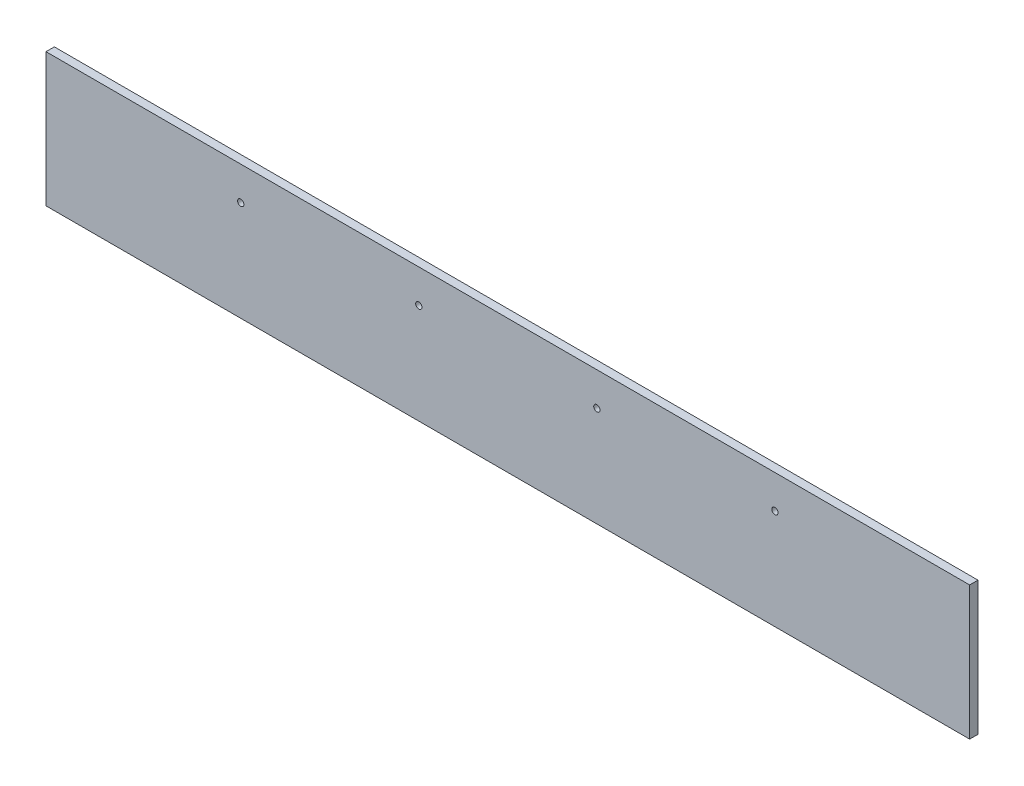
ISO-10303-21;
HEADER;
FILE_DESCRIPTION(('STEP AP214'),'2;1');
FILE_NAME('part.step','',(''),(''),'','','');
FILE_SCHEMA(('AUTOMOTIVE_DESIGN { 1 0 10303 214 1 1 1 1 }'));
ENDSEC;
DATA;
#1=APPLICATION_CONTEXT('core data for automotive mechanical design processes');
#2=APPLICATION_PROTOCOL_DEFINITION('international standard','automotive_design',2000,#1);
#3=PRODUCT_CONTEXT('',#1,'mechanical');
#4=PRODUCT('Part','Part','',(#3));
#5=PRODUCT_RELATED_PRODUCT_CATEGORY('part','',(#4));
#6=PRODUCT_DEFINITION_FORMATION('','',#4);
#7=PRODUCT_DEFINITION_CONTEXT('part definition',#1,'design');
#8=PRODUCT_DEFINITION('design','',#6,#7);
#9=PRODUCT_DEFINITION_SHAPE('','',#8);
#10=(LENGTH_UNIT() NAMED_UNIT(*) SI_UNIT(.MILLI.,.METRE.));
#11=(NAMED_UNIT(*) PLANE_ANGLE_UNIT() SI_UNIT($,.RADIAN.));
#12=(NAMED_UNIT(*) SI_UNIT($,.STERADIAN.) SOLID_ANGLE_UNIT());
#13=UNCERTAINTY_MEASURE_WITH_UNIT(LENGTH_MEASURE(1.E-05),#10,'distance_accuracy_value','');
#14=(GEOMETRIC_REPRESENTATION_CONTEXT(3) GLOBAL_UNCERTAINTY_ASSIGNED_CONTEXT((#13)) GLOBAL_UNIT_ASSIGNED_CONTEXT((#10,
#11,#12)) REPRESENTATION_CONTEXT('',''));
#15=CARTESIAN_POINT('',(0.,0.,0.));
#16=DIRECTION('',(0.,0.,1.));
#17=DIRECTION('',(1.,0.,0.));
#18=AXIS2_PLACEMENT_3D('',#15,#16,#17);
#19=CARTESIAN_POINT('',(0.,152.4,0.));
#20=DIRECTION('',(0.,1.,0.));
#21=DIRECTION('',(0.,0.,1.));
#22=AXIS2_PLACEMENT_3D('',#19,#20,#21);
#23=PLANE('',#22);
#24=DIRECTION('',(1.,0.,0.));
#25=VECTOR('',#24,1.);
#26=CARTESIAN_POINT('',(-558.014668370825,152.4,451.049254854641));
#27=LINE('',#26,#25);
#28=CARTESIAN_POINT('',(-558.014668370825,152.4,451.049254854641));
#29=VERTEX_POINT('',#28);
#30=CARTESIAN_POINT('',(496.085331629175,152.4,451.049254854641));
#31=VERTEX_POINT('',#30);
#32=EDGE_CURVE('E126',#29,#31,#27,.T.);
#33=ORIENTED_EDGE('',*,*,#32,.F.);
#34=DIRECTION('',(0.,0.,1.));
#35=VECTOR('',#34,1.);
#36=CARTESIAN_POINT('',(-558.014668370825,152.4,0.));
#37=LINE('',#36,#35);
#38=CARTESIAN_POINT('',(-558.014668370825,152.4,460.574254854641));
#39=VERTEX_POINT('',#38);
#40=EDGE_CURVE('E110',#29,#39,#37,.T.);
#41=ORIENTED_EDGE('',*,*,#40,.T.);
#42=DIRECTION('',(1.,0.,0.));
#43=VECTOR('',#42,1.);
#44=CARTESIAN_POINT('',(-567.539668370825,152.4,460.574254854641));
#45=LINE('',#44,#43);
#46=CARTESIAN_POINT('',(496.085331629175,152.4,460.574254854641));
#47=VERTEX_POINT('',#46);
#48=EDGE_CURVE('E124',#39,#47,#45,.T.);
#49=ORIENTED_EDGE('',*,*,#48,.T.);
#50=DIRECTION('',(0.,0.,-1.));
#51=VECTOR('',#50,1.);
#52=CARTESIAN_POINT('',(496.085331629173,152.4,-2.89115673151451E-12));
#53=LINE('',#52,#51);
#54=EDGE_CURVE('E151',#47,#31,#53,.T.);
#55=ORIENTED_EDGE('',*,*,#54,.T.);
#56=EDGE_LOOP('',(#33,#41,#49,#55));
#57=FACE_BOUND('',#56,.T.);
#58=ADVANCED_FACE('F47',(#57),#23,.T.);
#59=CARTESIAN_POINT('',(-567.539668370825,152.4,460.574254854641));
#60=DIRECTION('',(0.,0.,-1.));
#61=DIRECTION('',(-1.,0.,0.));
#62=AXIS2_PLACEMENT_3D('',#59,#60,#61);
#63=PLANE('',#62);
#64=CARTESIAN_POINT('',(273.835331629175,114.3,460.574254854641));
#65=DIRECTION('',(0.,0.,1.));
#66=DIRECTION('',(1.,0.,0.));
#67=AXIS2_PLACEMENT_3D('',#64,#65,#66);
#68=CIRCLE('',#67,3.56869999999998);
#69=CARTESIAN_POINT('',(277.404031629175,114.3,460.574254854641));
#70=VERTEX_POINT('',#69);
#71=EDGE_CURVE('E162',#70,#70,#68,.T.);
#72=ORIENTED_EDGE('',*,*,#71,.F.);
#73=EDGE_LOOP('',(#72));
#74=FACE_BOUND('',#73,.T.);
#75=CARTESIAN_POINT('',(70.6353316291751,114.3,460.574254854641));
#76=DIRECTION('',(0.,0.,1.));
#77=DIRECTION('',(1.,0.,0.));
#78=AXIS2_PLACEMENT_3D('',#75,#76,#77);
#79=CIRCLE('',#78,3.5687);
#80=CARTESIAN_POINT('',(74.2040316291751,114.3,460.574254854641));
#81=VERTEX_POINT('',#80);
#82=EDGE_CURVE('E166',#81,#81,#79,.T.);
#83=ORIENTED_EDGE('',*,*,#82,.F.);
#84=EDGE_LOOP('',(#83));
#85=FACE_BOUND('',#84,.T.);
#86=CARTESIAN_POINT('',(-132.564668370825,114.3,460.574254854641));
#87=DIRECTION('',(0.,0.,1.));
#88=DIRECTION('',(1.,0.,0.));
#89=AXIS2_PLACEMENT_3D('',#86,#87,#88);
#90=CIRCLE('',#89,3.56870000000001);
#91=CARTESIAN_POINT('',(-128.995968370825,114.3,460.574254854641));
#92=VERTEX_POINT('',#91);
#93=EDGE_CURVE('E169',#92,#92,#90,.T.);
#94=ORIENTED_EDGE('',*,*,#93,.F.);
#95=EDGE_LOOP('',(#94));
#96=FACE_BOUND('',#95,.T.);
#97=CARTESIAN_POINT('',(-335.764668370825,114.3,460.574254854641));
#98=DIRECTION('',(0.,0.,1.));
#99=DIRECTION('',(1.,0.,0.));
#100=AXIS2_PLACEMENT_3D('',#97,#98,#99);
#101=CIRCLE('',#100,3.56869999999998);
#102=CARTESIAN_POINT('',(-332.195968370825,114.3,460.574254854641));
#103=VERTEX_POINT('',#102);
#104=EDGE_CURVE('E161',#103,#103,#101,.T.);
#105=ORIENTED_EDGE('',*,*,#104,.F.);
#106=EDGE_LOOP('',(#105));
#107=FACE_BOUND('',#106,.T.);
#108=DIRECTION('',(0.,-1.,0.));
#109=VECTOR('',#108,1.);
#110=CARTESIAN_POINT('',(-558.014668370825,164.465,460.574254854641));
#111=LINE('',#110,#109);
#112=CARTESIAN_POINT('',(-558.014668370825,0.,460.574254854641));
#113=VERTEX_POINT('',#112);
#114=EDGE_CURVE('E107',#39,#113,#111,.T.);
#115=ORIENTED_EDGE('',*,*,#114,.T.);
#116=DIRECTION('',(1.,0.,0.));
#117=VECTOR('',#116,1.);
#118=CARTESIAN_POINT('',(-567.539668370825,0.,460.574254854641));
#119=LINE('',#118,#117);
#120=CARTESIAN_POINT('',(496.085331629175,0.,460.574254854641));
#121=VERTEX_POINT('',#120);
#122=EDGE_CURVE('E131',#113,#121,#119,.T.);
#123=ORIENTED_EDGE('',*,*,#122,.T.);
#124=DIRECTION('',(0.,-1.,0.));
#125=VECTOR('',#124,1.);
#126=CARTESIAN_POINT('',(496.085331629175,164.465,460.574254854641));
#127=LINE('',#126,#125);
#128=EDGE_CURVE('E118',#47,#121,#127,.T.);
#129=ORIENTED_EDGE('',*,*,#128,.F.);
#130=ORIENTED_EDGE('',*,*,#48,.F.);
#131=EDGE_LOOP('',(#115,#123,#129,#130));
#132=FACE_BOUND('',#131,.T.);
#133=ADVANCED_FACE('F49',(#74,#85,#96,#107,#132),#63,.F.);
#134=CARTESIAN_POINT('',(0.,0.,0.));
#135=DIRECTION('',(0.,1.,0.));
#136=DIRECTION('',(0.,0.,1.));
#137=AXIS2_PLACEMENT_3D('',#134,#135,#136);
#138=PLANE('',#137);
#139=DIRECTION('',(0.,0.,1.));
#140=VECTOR('',#139,1.);
#141=CARTESIAN_POINT('',(-558.014668370825,0.,0.));
#142=LINE('',#141,#140);
#143=CARTESIAN_POINT('',(-558.014668370825,0.,451.049254854641));
#144=VERTEX_POINT('',#143);
#145=EDGE_CURVE('E113',#144,#113,#142,.T.);
#146=ORIENTED_EDGE('',*,*,#145,.F.);
#147=DIRECTION('',(-0.707106781186547,0.,0.707106781186548));
#148=VECTOR('',#147,1.);
#149=CARTESIAN_POINT('',(-415.139668370826,0.,308.174254854641));
#150=LINE('',#149,#148);
#151=CARTESIAN_POINT('',(-415.139668370826,0.,308.174254854641));
#152=VERTEX_POINT('',#151);
#153=EDGE_CURVE('E145',#152,#144,#150,.T.);
#154=ORIENTED_EDGE('',*,*,#153,.F.);
#155=DIRECTION('',(1.,0.,0.));
#156=VECTOR('',#155,1.);
#157=CARTESIAN_POINT('',(0.,0.,308.174254854641));
#158=LINE('',#157,#156);
#159=CARTESIAN_POINT('',(353.210331629175,0.,308.174254854641));
#160=VERTEX_POINT('',#159);
#161=EDGE_CURVE('E130',#152,#160,#158,.T.);
#162=ORIENTED_EDGE('',*,*,#161,.T.);
#163=DIRECTION('',(-0.707106781186548,0.,-0.707106781186547));
#164=VECTOR('',#163,1.);
#165=CARTESIAN_POINT('',(505.610331629175,0.,460.574254854641));
#166=LINE('',#165,#164);
#167=CARTESIAN_POINT('',(496.085331629175,0.,451.049254854641));
#168=VERTEX_POINT('',#167);
#169=EDGE_CURVE('E63',#168,#160,#166,.T.);
#170=ORIENTED_EDGE('',*,*,#169,.F.);
#171=DIRECTION('',(0.,0.,-1.));
#172=VECTOR('',#171,1.);
#173=CARTESIAN_POINT('',(496.085331629173,0.,-2.89115673151451E-12));
#174=LINE('',#173,#172);
#175=EDGE_CURVE('E127',#121,#168,#174,.T.);
#176=ORIENTED_EDGE('',*,*,#175,.F.);
#177=ORIENTED_EDGE('',*,*,#122,.F.);
#178=EDGE_LOOP('',(#146,#154,#162,#170,#176,#177));
#179=FACE_BOUND('',#178,.T.);
#180=ADVANCED_FACE('F144',(#179),#138,.F.);
#181=CARTESIAN_POINT('',(505.610331629175,1016.,460.574254854641));
#182=DIRECTION('',(-0.707106781186547,0.,0.707106781186548));
#183=DIRECTION('',(0.707106781186548,0.,0.707106781186547));
#184=AXIS2_PLACEMENT_3D('',#181,#182,#183);
#185=PLANE('',#184);
#186=DIRECTION('',(0.,1.,0.));
#187=VECTOR('',#186,1.);
#188=CARTESIAN_POINT('',(496.085331629175,1016.,451.049254854641));
#189=LINE('',#188,#187);
#190=CARTESIAN_POINT('',(496.085331629175,9.52500000000001,451.049254854641));
#191=VERTEX_POINT('',#190);
#192=EDGE_CURVE('E11',#168,#191,#189,.T.);
#193=ORIENTED_EDGE('',*,*,#192,.F.);
#194=ORIENTED_EDGE('',*,*,#169,.T.);
#195=DIRECTION('',(0.,1.,0.));
#196=VECTOR('',#195,1.);
#197=CARTESIAN_POINT('',(353.210331629175,-133.35,308.174254854641));
#198=LINE('',#197,#196);
#199=CARTESIAN_POINT('',(353.210331629175,9.52500000000001,308.174254854641));
#200=VERTEX_POINT('',#199);
#201=EDGE_CURVE('E176',#160,#200,#198,.T.);
#202=ORIENTED_EDGE('',*,*,#201,.T.);
#203=DIRECTION('',(-0.707106781186548,0.,-0.707106781186547));
#204=VECTOR('',#203,1.);
#205=CARTESIAN_POINT('',(22.5180383872667,9.52500000000001,-22.5180383872667));
#206=LINE('',#205,#204);
#207=EDGE_CURVE('E153',#191,#200,#206,.T.);
#208=ORIENTED_EDGE('',*,*,#207,.F.);
#209=EDGE_LOOP('',(#193,#194,#202,#208));
#210=FACE_BOUND('',#209,.T.);
#211=ADVANCED_FACE('F214',(#210),#185,.F.);
#212=CARTESIAN_POINT('',(-415.139668370826,1016.,308.174254854641));
#213=DIRECTION('',(0.707106781186548,0.,0.707106781186547));
#214=DIRECTION('',(0.707106781186547,0.,-0.707106781186548));
#215=AXIS2_PLACEMENT_3D('',#212,#213,#214);
#216=PLANE('',#215);
#217=DIRECTION('',(0.,-1.,0.));
#218=VECTOR('',#217,1.);
#219=CARTESIAN_POINT('',(-558.014668370825,1016.,451.049254854641));
#220=LINE('',#219,#218);
#221=CARTESIAN_POINT('',(-558.014668370825,9.52500000000001,451.049254854641));
#222=VERTEX_POINT('',#221);
#223=EDGE_CURVE('E56',#222,#144,#220,.T.);
#224=ORIENTED_EDGE('',*,*,#223,.F.);
#225=DIRECTION('',(-0.707106781186547,0.,0.707106781186548));
#226=VECTOR('',#225,1.);
#227=CARTESIAN_POINT('',(-53.4827067580927,9.52500000000001,-53.4827067580926));
#228=LINE('',#227,#226);
#229=CARTESIAN_POINT('',(-415.139668370826,9.52500000000001,308.174254854641));
#230=VERTEX_POINT('',#229);
#231=EDGE_CURVE('E71',#230,#222,#228,.T.);
#232=ORIENTED_EDGE('',*,*,#231,.F.);
#233=DIRECTION('',(0.,1.,0.));
#234=VECTOR('',#233,1.);
#235=CARTESIAN_POINT('',(-415.139668370826,-133.35,308.174254854641));
#236=LINE('',#235,#234);
#237=EDGE_CURVE('E150',#152,#230,#236,.T.);
#238=ORIENTED_EDGE('',*,*,#237,.F.);
#239=ORIENTED_EDGE('',*,*,#153,.T.);
#240=EDGE_LOOP('',(#224,#232,#238,#239));
#241=FACE_BOUND('',#240,.T.);
#242=ADVANCED_FACE('F149',(#241),#216,.F.);
#243=CARTESIAN_POINT('',(0.,9.52500000000001,0.));
#244=DIRECTION('',(0.,-1.,0.));
#245=DIRECTION('',(0.,0.,-1.));
#246=AXIS2_PLACEMENT_3D('',#243,#244,#245);
#247=PLANE('',#246);
#248=DIRECTION('',(1.,0.,0.));
#249=VECTOR('',#248,1.);
#250=CARTESIAN_POINT('',(-415.139668370826,9.52500000000001,308.174254854641));
#251=LINE('',#250,#249);
#252=EDGE_CURVE('E165',#230,#200,#251,.T.);
#253=ORIENTED_EDGE('',*,*,#252,.F.);
#254=ORIENTED_EDGE('',*,*,#231,.T.);
#255=DIRECTION('',(1.,0.,0.));
#256=VECTOR('',#255,1.);
#257=CARTESIAN_POINT('',(-558.014668370825,9.52500000000001,451.049254854641));
#258=LINE('',#257,#256);
#259=EDGE_CURVE('E179',#222,#191,#258,.T.);
#260=ORIENTED_EDGE('',*,*,#259,.T.);
#261=ORIENTED_EDGE('',*,*,#207,.T.);
#262=EDGE_LOOP('',(#253,#254,#260,#261));
#263=FACE_BOUND('',#262,.T.);
#264=ADVANCED_FACE('F191',(#263),#247,.F.);
#265=CARTESIAN_POINT('',(-558.014668370825,9.52500000000001,451.049254854641));
#266=DIRECTION('',(0.,0.,1.));
#267=DIRECTION('',(1.,0.,0.));
#268=AXIS2_PLACEMENT_3D('',#265,#266,#267);
#269=PLANE('',#268);
#270=CARTESIAN_POINT('',(-335.764668370825,114.3,451.049254854641));
#271=DIRECTION('',(0.,0.,-1.));
#272=DIRECTION('',(-1.,0.,0.));
#273=AXIS2_PLACEMENT_3D('',#270,#271,#272);
#274=CIRCLE('',#273,8.25512699999997);
#275=CARTESIAN_POINT('',(-344.019795370825,114.3,451.049254854641));
#276=VERTEX_POINT('',#275);
#277=EDGE_CURVE('E249',#276,#276,#274,.T.);
#278=ORIENTED_EDGE('',*,*,#277,.F.);
#279=EDGE_LOOP('',(#278));
#280=FACE_BOUND('',#279,.T.);
#281=CARTESIAN_POINT('',(-132.564668370825,114.3,451.049254854641));
#282=DIRECTION('',(0.,0.,-1.));
#283=DIRECTION('',(-1.,0.,0.));
#284=AXIS2_PLACEMENT_3D('',#281,#282,#283);
#285=CIRCLE('',#284,8.255127);
#286=CARTESIAN_POINT('',(-140.819795370825,114.3,451.049254854641));
#287=VERTEX_POINT('',#286);
#288=EDGE_CURVE('E248',#287,#287,#285,.T.);
#289=ORIENTED_EDGE('',*,*,#288,.F.);
#290=EDGE_LOOP('',(#289));
#291=FACE_BOUND('',#290,.T.);
#292=CARTESIAN_POINT('',(70.6353316291751,114.3,451.049254854641));
#293=DIRECTION('',(0.,0.,-1.));
#294=DIRECTION('',(-1.,0.,0.));
#295=AXIS2_PLACEMENT_3D('',#292,#293,#294);
#296=CIRCLE('',#295,8.255127);
#297=CARTESIAN_POINT('',(62.3802046291751,114.3,451.049254854641));
#298=VERTEX_POINT('',#297);
#299=EDGE_CURVE('E259',#298,#298,#296,.T.);
#300=ORIENTED_EDGE('',*,*,#299,.F.);
#301=EDGE_LOOP('',(#300));
#302=FACE_BOUND('',#301,.T.);
#303=CARTESIAN_POINT('',(273.835331629175,114.3,451.049254854641));
#304=DIRECTION('',(0.,0.,-1.));
#305=DIRECTION('',(-1.,0.,0.));
#306=AXIS2_PLACEMENT_3D('',#303,#304,#305);
#307=CIRCLE('',#306,8.25512699999997);
#308=CARTESIAN_POINT('',(265.580204629175,114.3,451.049254854641));
#309=VERTEX_POINT('',#308);
#310=EDGE_CURVE('E265',#309,#309,#307,.T.);
#311=ORIENTED_EDGE('',*,*,#310,.F.);
#312=EDGE_LOOP('',(#311));
#313=FACE_BOUND('',#312,.T.);
#314=ORIENTED_EDGE('',*,*,#32,.T.);
#315=DIRECTION('',(0.,1.,0.));
#316=VECTOR('',#315,1.);
#317=CARTESIAN_POINT('',(496.085331629175,9.52500000000001,451.049254854641));
#318=LINE('',#317,#316);
#319=EDGE_CURVE('E135',#191,#31,#318,.T.);
#320=ORIENTED_EDGE('',*,*,#319,.F.);
#321=ORIENTED_EDGE('',*,*,#259,.F.);
#322=DIRECTION('',(0.,1.,0.));
#323=VECTOR('',#322,1.);
#324=CARTESIAN_POINT('',(-558.014668370825,9.52500000000001,451.049254854641));
#325=LINE('',#324,#323);
#326=EDGE_CURVE('E140',#222,#29,#325,.T.);
#327=ORIENTED_EDGE('',*,*,#326,.T.);
#328=EDGE_LOOP('',(#314,#320,#321,#327));
#329=FACE_BOUND('',#328,.T.);
#330=ADVANCED_FACE('F188',(#280,#291,#302,#313,#329),#269,.F.);
#331=CARTESIAN_POINT('',(-415.139668370826,-133.35,308.174254854641));
#332=DIRECTION('',(0.,0.,1.));
#333=DIRECTION('',(1.,0.,0.));
#334=AXIS2_PLACEMENT_3D('',#331,#332,#333);
#335=PLANE('',#334);
#336=ORIENTED_EDGE('',*,*,#237,.T.);
#337=ORIENTED_EDGE('',*,*,#252,.T.);
#338=ORIENTED_EDGE('',*,*,#201,.F.);
#339=ORIENTED_EDGE('',*,*,#161,.F.);
#340=EDGE_LOOP('',(#336,#337,#338,#339));
#341=FACE_BOUND('',#340,.T.);
#342=ADVANCED_FACE('F190',(#341),#335,.F.);
#343=CARTESIAN_POINT('',(-335.764668370825,114.3,-809.425745145359));
#344=DIRECTION('',(0.,0.,1.));
#345=DIRECTION('',(1.,0.,0.));
#346=AXIS2_PLACEMENT_3D('',#343,#344,#345);
#347=CYLINDRICAL_SURFACE('',#346,3.56869999999998);
#348=CARTESIAN_POINT('',(-335.764668370825,114.3,454.98163402188));
#349=DIRECTION('',(0.,0.,-1.));
#350=DIRECTION('',(-1.,0.,0.));
#351=AXIS2_PLACEMENT_3D('',#348,#349,#350);
#352=CIRCLE('',#351,3.56869999999998);
#353=CARTESIAN_POINT('',(-332.195968370825,114.3,454.98163402188));
#354=VERTEX_POINT('',#353);
#355=EDGE_CURVE('E51',#354,#354,#352,.T.);
#356=CARTESIAN_POINT('',(-332.195968370825,114.3,454.98163402188));
#357=CARTESIAN_POINT('',(-332.195968370825,114.3,455.039890488888));
#358=CARTESIAN_POINT('',(-332.195968370825,114.3,455.098146955896));
#359=CARTESIAN_POINT('',(-332.195968370825,114.3,455.214659889912));
#360=CARTESIAN_POINT('',(-332.195968370825,114.3,455.27291635692));
#361=CARTESIAN_POINT('',(-332.195968370825,114.3,455.389429290936));
#362=CARTESIAN_POINT('',(-332.195968370825,114.3,455.447685757944));
#363=CARTESIAN_POINT('',(-332.195968370825,114.3,455.564198691959));
#364=CARTESIAN_POINT('',(-332.195968370825,114.3,455.622455158967));
#365=CARTESIAN_POINT('',(-332.195968370825,114.3,455.738968092983));
#366=CARTESIAN_POINT('',(-332.195968370825,114.3,455.797224559991));
#367=CARTESIAN_POINT('',(-332.195968370825,114.3,455.913737494007));
#368=CARTESIAN_POINT('',(-332.195968370825,114.3,455.971993961015));
#369=CARTESIAN_POINT('',(-332.195968370825,114.3,456.088506895031));
#370=CARTESIAN_POINT('',(-332.195968370825,114.3,456.146763362039));
#371=CARTESIAN_POINT('',(-332.195968370825,114.3,456.263276296055));
#372=CARTESIAN_POINT('',(-332.195968370825,114.3,456.321532763062));
#373=CARTESIAN_POINT('',(-332.195968370825,114.3,456.438045697078));
#374=CARTESIAN_POINT('',(-332.195968370825,114.3,456.496302164086));
#375=CARTESIAN_POINT('',(-332.195968370825,114.3,456.612815098102));
#376=CARTESIAN_POINT('',(-332.195968370825,114.3,456.67107156511));
#377=CARTESIAN_POINT('',(-332.195968370825,114.3,456.787584499126));
#378=CARTESIAN_POINT('',(-332.195968370825,114.3,456.845840966134));
#379=CARTESIAN_POINT('',(-332.195968370825,114.3,456.962353900149));
#380=CARTESIAN_POINT('',(-332.195968370825,114.3,457.020610367157));
#381=CARTESIAN_POINT('',(-332.195968370825,114.3,457.137123301173));
#382=CARTESIAN_POINT('',(-332.195968370825,114.3,457.195379768181));
#383=CARTESIAN_POINT('',(-332.195968370825,114.3,457.311892702197));
#384=CARTESIAN_POINT('',(-332.195968370825,114.3,457.370149169205));
#385=CARTESIAN_POINT('',(-332.195968370825,114.3,457.486662103221));
#386=CARTESIAN_POINT('',(-332.195968370825,114.3,457.544918570229));
#387=CARTESIAN_POINT('',(-332.195968370825,114.3,457.661431504245));
#388=CARTESIAN_POINT('',(-332.195968370825,114.3,457.719687971252));
#389=CARTESIAN_POINT('',(-332.195968370825,114.3,457.836200905268));
#390=CARTESIAN_POINT('',(-332.195968370825,114.3,457.894457372276));
#391=CARTESIAN_POINT('',(-332.195968370825,114.3,458.010970306292));
#392=CARTESIAN_POINT('',(-332.195968370825,114.3,458.0692267733));
#393=CARTESIAN_POINT('',(-332.195968370825,114.3,458.185739707316));
#394=CARTESIAN_POINT('',(-332.195968370825,114.3,458.243996174324));
#395=CARTESIAN_POINT('',(-332.195968370825,114.3,458.36050910834));
#396=CARTESIAN_POINT('',(-332.195968370825,114.3,458.418765575348));
#397=CARTESIAN_POINT('',(-332.195968370825,114.3,458.535278509363));
#398=CARTESIAN_POINT('',(-332.195968370825,114.3,458.593534976371));
#399=CARTESIAN_POINT('',(-332.195968370825,114.3,458.710047910387));
#400=CARTESIAN_POINT('',(-332.195968370825,114.3,458.768304377395));
#401=CARTESIAN_POINT('',(-332.195968370825,114.3,458.884817311411));
#402=CARTESIAN_POINT('',(-332.195968370825,114.3,458.943073778419));
#403=CARTESIAN_POINT('',(-332.195968370825,114.3,459.059586712435));
#404=CARTESIAN_POINT('',(-332.195968370825,114.3,459.117843179443));
#405=CARTESIAN_POINT('',(-332.195968370825,114.3,459.234356113458));
#406=CARTESIAN_POINT('',(-332.195968370825,114.3,459.292612580466));
#407=CARTESIAN_POINT('',(-332.195968370825,114.3,459.409125514482));
#408=CARTESIAN_POINT('',(-332.195968370825,114.3,459.46738198149));
#409=CARTESIAN_POINT('',(-332.195968370825,114.3,459.583894915506));
#410=CARTESIAN_POINT('',(-332.195968370825,114.3,459.642151382514));
#411=CARTESIAN_POINT('',(-332.195968370825,114.3,459.75866431653));
#412=CARTESIAN_POINT('',(-332.195968370825,114.3,459.816920783537));
#413=CARTESIAN_POINT('',(-332.195968370825,114.3,459.933433717553));
#414=CARTESIAN_POINT('',(-332.195968370825,114.3,459.991690184561));
#415=CARTESIAN_POINT('',(-332.195968370825,114.3,460.108203118577));
#416=CARTESIAN_POINT('',(-332.195968370825,114.3,460.166459585585));
#417=CARTESIAN_POINT('',(-332.195968370825,114.3,460.282972519601));
#418=CARTESIAN_POINT('',(-332.195968370825,114.3,460.341228986609));
#419=CARTESIAN_POINT('',(-332.195968370825,114.3,460.457741920625));
#420=CARTESIAN_POINT('',(-332.195968370825,114.3,460.515998387633));
#421=CARTESIAN_POINT('',(-332.195968370825,114.3,460.574254854641));
#422=B_SPLINE_CURVE_WITH_KNOTS('',3,(#356,#357,#358,#359,#360,#361,#362,#363,#364,#365,#366,
#367,#368,#369,#370,#371,#372,#373,#374,#375,#376,#377,#378,#379,#380,#381,#382,#383,#384,#385,
#386,#387,#388,#389,#390,#391,#392,#393,#394,#395,#396,#397,#398,#399,#400,#401,#402,#403,#404,
#405,#406,#407,#408,#409,#410,#411,#412,#413,#414,#415,#416,#417,#418,#419,#420,#421),
.UNSPECIFIED.,.F.,.F.,(4,2,2,2,2,2,2,2,2,2,2,2,2,2,2,2,2,2,2,2,2,2,2,2,2,2,2,2,2,2,2,2,4),(0.,
0.174769401023678,0.349538802047578,0.524308203071255,0.699077604095155,0.873847005118833,
1.04861640614251,1.22338580716641,1.39815520819009,1.57292460921377,1.74769401023767,
1.92246341126134,2.09723281228502,2.27200221330892,2.4467716143326,2.6215410153565,
2.79631041638018,2.97107981740385,3.14584921842775,3.32061861945143,3.49538802047533,
3.67015742149901,3.84492682252269,4.01969622354659,4.19446562457026,4.36923502559394,
4.54400442661784,4.71877382764152,4.8935432286652,5.0683126296891,5.24308203071278,
5.41785143173668,5.59262083276035),.UNSPECIFIED.);
#423=EDGE_CURVE('BSEAM199',#354,#103,#422,.T.);
#424=ORIENTED_EDGE('',*,*,#355,.T.);
#425=ORIENTED_EDGE('',*,*,#104,.T.);
#426=ORIENTED_EDGE('',*,*,#423,.T.);
#427=ORIENTED_EDGE('',*,*,#423,.F.);
#428=EDGE_LOOP('',(#424,#426,#425,#427));
#429=FACE_BOUND('',#428,.T.);
#430=ADVANCED_FACE('F199',(#429),#347,.F.);
#431=CARTESIAN_POINT('',(-132.564668370825,114.3,-809.425745145359));
#432=DIRECTION('',(0.,0.,1.));
#433=DIRECTION('',(1.,0.,0.));
#434=AXIS2_PLACEMENT_3D('',#431,#432,#433);
#435=CYLINDRICAL_SURFACE('',#434,3.56870000000001);
#436=CARTESIAN_POINT('',(-132.564668370825,114.3,454.98163402188));
#437=DIRECTION('',(0.,0.,-1.));
#438=DIRECTION('',(-1.,0.,0.));
#439=AXIS2_PLACEMENT_3D('',#436,#437,#438);
#440=CIRCLE('',#439,3.56870000000001);
#441=CARTESIAN_POINT('',(-128.995968370825,114.3,454.98163402188));
#442=VERTEX_POINT('',#441);
#443=EDGE_CURVE('E251',#442,#442,#440,.T.);
#444=CARTESIAN_POINT('',(-128.995968370825,114.3,454.98163402188));
#445=CARTESIAN_POINT('',(-128.995968370825,114.3,455.039890488888));
#446=CARTESIAN_POINT('',(-128.995968370825,114.3,455.098146955896));
#447=CARTESIAN_POINT('',(-128.995968370825,114.3,455.214659889912));
#448=CARTESIAN_POINT('',(-128.995968370825,114.3,455.27291635692));
#449=CARTESIAN_POINT('',(-128.995968370825,114.3,455.389429290936));
#450=CARTESIAN_POINT('',(-128.995968370825,114.3,455.447685757944));
#451=CARTESIAN_POINT('',(-128.995968370825,114.3,455.564198691959));
#452=CARTESIAN_POINT('',(-128.995968370825,114.3,455.622455158967));
#453=CARTESIAN_POINT('',(-128.995968370825,114.3,455.738968092983));
#454=CARTESIAN_POINT('',(-128.995968370825,114.3,455.797224559991));
#455=CARTESIAN_POINT('',(-128.995968370825,114.3,455.913737494007));
#456=CARTESIAN_POINT('',(-128.995968370825,114.3,455.971993961015));
#457=CARTESIAN_POINT('',(-128.995968370825,114.3,456.088506895031));
#458=CARTESIAN_POINT('',(-128.995968370825,114.3,456.146763362039));
#459=CARTESIAN_POINT('',(-128.995968370825,114.3,456.263276296055));
#460=CARTESIAN_POINT('',(-128.995968370825,114.3,456.321532763062));
#461=CARTESIAN_POINT('',(-128.995968370825,114.3,456.438045697078));
#462=CARTESIAN_POINT('',(-128.995968370825,114.3,456.496302164086));
#463=CARTESIAN_POINT('',(-128.995968370825,114.3,456.612815098102));
#464=CARTESIAN_POINT('',(-128.995968370825,114.3,456.67107156511));
#465=CARTESIAN_POINT('',(-128.995968370825,114.3,456.787584499126));
#466=CARTESIAN_POINT('',(-128.995968370825,114.3,456.845840966134));
#467=CARTESIAN_POINT('',(-128.995968370825,114.3,456.962353900149));
#468=CARTESIAN_POINT('',(-128.995968370825,114.3,457.020610367157));
#469=CARTESIAN_POINT('',(-128.995968370825,114.3,457.137123301173));
#470=CARTESIAN_POINT('',(-128.995968370825,114.3,457.195379768181));
#471=CARTESIAN_POINT('',(-128.995968370825,114.3,457.311892702197));
#472=CARTESIAN_POINT('',(-128.995968370825,114.3,457.370149169205));
#473=CARTESIAN_POINT('',(-128.995968370825,114.3,457.486662103221));
#474=CARTESIAN_POINT('',(-128.995968370825,114.3,457.544918570229));
#475=CARTESIAN_POINT('',(-128.995968370825,114.3,457.661431504245));
#476=CARTESIAN_POINT('',(-128.995968370825,114.3,457.719687971252));
#477=CARTESIAN_POINT('',(-128.995968370825,114.3,457.836200905268));
#478=CARTESIAN_POINT('',(-128.995968370825,114.3,457.894457372276));
#479=CARTESIAN_POINT('',(-128.995968370825,114.3,458.010970306292));
#480=CARTESIAN_POINT('',(-128.995968370825,114.3,458.0692267733));
#481=CARTESIAN_POINT('',(-128.995968370825,114.3,458.185739707316));
#482=CARTESIAN_POINT('',(-128.995968370825,114.3,458.243996174324));
#483=CARTESIAN_POINT('',(-128.995968370825,114.3,458.36050910834));
#484=CARTESIAN_POINT('',(-128.995968370825,114.3,458.418765575348));
#485=CARTESIAN_POINT('',(-128.995968370825,114.3,458.535278509363));
#486=CARTESIAN_POINT('',(-128.995968370825,114.3,458.593534976371));
#487=CARTESIAN_POINT('',(-128.995968370825,114.3,458.710047910387));
#488=CARTESIAN_POINT('',(-128.995968370825,114.3,458.768304377395));
#489=CARTESIAN_POINT('',(-128.995968370825,114.3,458.884817311411));
#490=CARTESIAN_POINT('',(-128.995968370825,114.3,458.943073778419));
#491=CARTESIAN_POINT('',(-128.995968370825,114.3,459.059586712435));
#492=CARTESIAN_POINT('',(-128.995968370825,114.3,459.117843179443));
#493=CARTESIAN_POINT('',(-128.995968370825,114.3,459.234356113458));
#494=CARTESIAN_POINT('',(-128.995968370825,114.3,459.292612580466));
#495=CARTESIAN_POINT('',(-128.995968370825,114.3,459.409125514482));
#496=CARTESIAN_POINT('',(-128.995968370825,114.3,459.46738198149));
#497=CARTESIAN_POINT('',(-128.995968370825,114.3,459.583894915506));
#498=CARTESIAN_POINT('',(-128.995968370825,114.3,459.642151382514));
#499=CARTESIAN_POINT('',(-128.995968370825,114.3,459.75866431653));
#500=CARTESIAN_POINT('',(-128.995968370825,114.3,459.816920783537));
#501=CARTESIAN_POINT('',(-128.995968370825,114.3,459.933433717553));
#502=CARTESIAN_POINT('',(-128.995968370825,114.3,459.991690184561));
#503=CARTESIAN_POINT('',(-128.995968370825,114.3,460.108203118577));
#504=CARTESIAN_POINT('',(-128.995968370825,114.3,460.166459585585));
#505=CARTESIAN_POINT('',(-128.995968370825,114.3,460.282972519601));
#506=CARTESIAN_POINT('',(-128.995968370825,114.3,460.341228986609));
#507=CARTESIAN_POINT('',(-128.995968370825,114.3,460.457741920625));
#508=CARTESIAN_POINT('',(-128.995968370825,114.3,460.515998387633));
#509=CARTESIAN_POINT('',(-128.995968370825,114.3,460.574254854641));
#510=B_SPLINE_CURVE_WITH_KNOTS('',3,(#444,#445,#446,#447,#448,#449,#450,#451,#452,#453,#454,
#455,#456,#457,#458,#459,#460,#461,#462,#463,#464,#465,#466,#467,#468,#469,#470,#471,#472,#473,
#474,#475,#476,#477,#478,#479,#480,#481,#482,#483,#484,#485,#486,#487,#488,#489,#490,#491,#492,
#493,#494,#495,#496,#497,#498,#499,#500,#501,#502,#503,#504,#505,#506,#507,#508,#509),
.UNSPECIFIED.,.F.,.F.,(4,2,2,2,2,2,2,2,2,2,2,2,2,2,2,2,2,2,2,2,2,2,2,2,2,2,2,2,2,2,2,2,4),(0.,
0.174769401023678,0.349538802047578,0.524308203071255,0.699077604095155,0.873847005118833,
1.04861640614251,1.22338580716641,1.39815520819009,1.57292460921377,1.74769401023767,
1.92246341126134,2.09723281228502,2.27200221330892,2.4467716143326,2.6215410153565,
2.79631041638018,2.97107981740385,3.14584921842775,3.32061861945143,3.49538802047533,
3.67015742149901,3.84492682252269,4.01969622354659,4.19446562457026,4.36923502559394,
4.54400442661784,4.71877382764152,4.8935432286652,5.0683126296891,5.24308203071278,
5.41785143173668,5.59262083276035),.UNSPECIFIED.);
#511=EDGE_CURVE('BSEAM233',#442,#92,#510,.T.);
#512=ORIENTED_EDGE('',*,*,#443,.T.);
#513=ORIENTED_EDGE('',*,*,#93,.T.);
#514=ORIENTED_EDGE('',*,*,#511,.T.);
#515=ORIENTED_EDGE('',*,*,#511,.F.);
#516=EDGE_LOOP('',(#512,#514,#513,#515));
#517=FACE_BOUND('',#516,.T.);
#518=ADVANCED_FACE('F233',(#517),#435,.F.);
#519=CARTESIAN_POINT('',(70.6353316291751,114.3,-809.425745145359));
#520=DIRECTION('',(0.,0.,1.));
#521=DIRECTION('',(1.,0.,0.));
#522=AXIS2_PLACEMENT_3D('',#519,#520,#521);
#523=CYLINDRICAL_SURFACE('',#522,3.5687);
#524=CARTESIAN_POINT('',(70.6353316291751,114.3,454.98163402188));
#525=DIRECTION('',(0.,0.,-1.));
#526=DIRECTION('',(-1.,0.,0.));
#527=AXIS2_PLACEMENT_3D('',#524,#525,#526);
#528=CIRCLE('',#527,3.5687);
#529=CARTESIAN_POINT('',(74.2040316291751,114.3,454.98163402188));
#530=VERTEX_POINT('',#529);
#531=EDGE_CURVE('E262',#530,#530,#528,.T.);
#532=CARTESIAN_POINT('',(74.2040316291751,114.3,454.98163402188));
#533=CARTESIAN_POINT('',(74.2040316291751,114.3,455.039890488888));
#534=CARTESIAN_POINT('',(74.2040316291751,114.3,455.098146955896));
#535=CARTESIAN_POINT('',(74.2040316291751,114.3,455.214659889912));
#536=CARTESIAN_POINT('',(74.2040316291751,114.3,455.27291635692));
#537=CARTESIAN_POINT('',(74.2040316291751,114.3,455.389429290936));
#538=CARTESIAN_POINT('',(74.2040316291751,114.3,455.447685757944));
#539=CARTESIAN_POINT('',(74.2040316291751,114.3,455.564198691959));
#540=CARTESIAN_POINT('',(74.2040316291751,114.3,455.622455158967));
#541=CARTESIAN_POINT('',(74.2040316291751,114.3,455.738968092983));
#542=CARTESIAN_POINT('',(74.2040316291751,114.3,455.797224559991));
#543=CARTESIAN_POINT('',(74.2040316291751,114.3,455.913737494007));
#544=CARTESIAN_POINT('',(74.2040316291751,114.3,455.971993961015));
#545=CARTESIAN_POINT('',(74.2040316291751,114.3,456.088506895031));
#546=CARTESIAN_POINT('',(74.2040316291751,114.3,456.146763362039));
#547=CARTESIAN_POINT('',(74.2040316291751,114.3,456.263276296055));
#548=CARTESIAN_POINT('',(74.2040316291751,114.3,456.321532763062));
#549=CARTESIAN_POINT('',(74.2040316291751,114.3,456.438045697078));
#550=CARTESIAN_POINT('',(74.2040316291751,114.3,456.496302164086));
#551=CARTESIAN_POINT('',(74.2040316291751,114.3,456.612815098102));
#552=CARTESIAN_POINT('',(74.2040316291751,114.3,456.67107156511));
#553=CARTESIAN_POINT('',(74.2040316291751,114.3,456.787584499126));
#554=CARTESIAN_POINT('',(74.2040316291751,114.3,456.845840966134));
#555=CARTESIAN_POINT('',(74.2040316291751,114.3,456.962353900149));
#556=CARTESIAN_POINT('',(74.2040316291751,114.3,457.020610367157));
#557=CARTESIAN_POINT('',(74.2040316291751,114.3,457.137123301173));
#558=CARTESIAN_POINT('',(74.2040316291751,114.3,457.195379768181));
#559=CARTESIAN_POINT('',(74.2040316291751,114.3,457.311892702197));
#560=CARTESIAN_POINT('',(74.2040316291751,114.3,457.370149169205));
#561=CARTESIAN_POINT('',(74.2040316291751,114.3,457.486662103221));
#562=CARTESIAN_POINT('',(74.2040316291751,114.3,457.544918570229));
#563=CARTESIAN_POINT('',(74.2040316291751,114.3,457.661431504245));
#564=CARTESIAN_POINT('',(74.2040316291751,114.3,457.719687971252));
#565=CARTESIAN_POINT('',(74.2040316291751,114.3,457.836200905268));
#566=CARTESIAN_POINT('',(74.2040316291751,114.3,457.894457372276));
#567=CARTESIAN_POINT('',(74.2040316291751,114.3,458.010970306292));
#568=CARTESIAN_POINT('',(74.2040316291751,114.3,458.0692267733));
#569=CARTESIAN_POINT('',(74.2040316291751,114.3,458.185739707316));
#570=CARTESIAN_POINT('',(74.2040316291751,114.3,458.243996174324));
#571=CARTESIAN_POINT('',(74.2040316291751,114.3,458.36050910834));
#572=CARTESIAN_POINT('',(74.2040316291751,114.3,458.418765575348));
#573=CARTESIAN_POINT('',(74.2040316291751,114.3,458.535278509363));
#574=CARTESIAN_POINT('',(74.2040316291751,114.3,458.593534976371));
#575=CARTESIAN_POINT('',(74.2040316291751,114.3,458.710047910387));
#576=CARTESIAN_POINT('',(74.2040316291751,114.3,458.768304377395));
#577=CARTESIAN_POINT('',(74.2040316291751,114.3,458.884817311411));
#578=CARTESIAN_POINT('',(74.2040316291751,114.3,458.943073778419));
#579=CARTESIAN_POINT('',(74.2040316291751,114.3,459.059586712435));
#580=CARTESIAN_POINT('',(74.2040316291751,114.3,459.117843179443));
#581=CARTESIAN_POINT('',(74.2040316291751,114.3,459.234356113458));
#582=CARTESIAN_POINT('',(74.2040316291751,114.3,459.292612580466));
#583=CARTESIAN_POINT('',(74.2040316291751,114.3,459.409125514482));
#584=CARTESIAN_POINT('',(74.2040316291751,114.3,459.46738198149));
#585=CARTESIAN_POINT('',(74.2040316291751,114.3,459.583894915506));
#586=CARTESIAN_POINT('',(74.2040316291751,114.3,459.642151382514));
#587=CARTESIAN_POINT('',(74.2040316291751,114.3,459.75866431653));
#588=CARTESIAN_POINT('',(74.2040316291751,114.3,459.816920783537));
#589=CARTESIAN_POINT('',(74.2040316291751,114.3,459.933433717553));
#590=CARTESIAN_POINT('',(74.2040316291751,114.3,459.991690184561));
#591=CARTESIAN_POINT('',(74.2040316291751,114.3,460.108203118577));
#592=CARTESIAN_POINT('',(74.2040316291751,114.3,460.166459585585));
#593=CARTESIAN_POINT('',(74.2040316291751,114.3,460.282972519601));
#594=CARTESIAN_POINT('',(74.2040316291751,114.3,460.341228986609));
#595=CARTESIAN_POINT('',(74.2040316291751,114.3,460.457741920625));
#596=CARTESIAN_POINT('',(74.2040316291751,114.3,460.515998387633));
#597=CARTESIAN_POINT('',(74.2040316291751,114.3,460.574254854641));
#598=B_SPLINE_CURVE_WITH_KNOTS('',3,(#532,#533,#534,#535,#536,#537,#538,#539,#540,#541,#542,
#543,#544,#545,#546,#547,#548,#549,#550,#551,#552,#553,#554,#555,#556,#557,#558,#559,#560,#561,
#562,#563,#564,#565,#566,#567,#568,#569,#570,#571,#572,#573,#574,#575,#576,#577,#578,#579,#580,
#581,#582,#583,#584,#585,#586,#587,#588,#589,#590,#591,#592,#593,#594,#595,#596,#597),
.UNSPECIFIED.,.F.,.F.,(4,2,2,2,2,2,2,2,2,2,2,2,2,2,2,2,2,2,2,2,2,2,2,2,2,2,2,2,2,2,2,2,4),(0.,
0.174769401023678,0.349538802047578,0.524308203071255,0.699077604095155,0.873847005118833,
1.04861640614251,1.22338580716641,1.39815520819009,1.57292460921377,1.74769401023767,
1.92246341126134,2.09723281228502,2.27200221330892,2.4467716143326,2.6215410153565,
2.79631041638018,2.97107981740385,3.14584921842775,3.32061861945143,3.49538802047533,
3.67015742149901,3.84492682252269,4.01969622354659,4.19446562457026,4.36923502559394,
4.54400442661784,4.71877382764152,4.8935432286652,5.0683126296891,5.24308203071278,
5.41785143173668,5.59262083276035),.UNSPECIFIED.);
#599=EDGE_CURVE('BSEAM229',#530,#81,#598,.T.);
#600=ORIENTED_EDGE('',*,*,#531,.T.);
#601=ORIENTED_EDGE('',*,*,#82,.T.);
#602=ORIENTED_EDGE('',*,*,#599,.T.);
#603=ORIENTED_EDGE('',*,*,#599,.F.);
#604=EDGE_LOOP('',(#600,#602,#601,#603));
#605=FACE_BOUND('',#604,.T.);
#606=ADVANCED_FACE('F229',(#605),#523,.F.);
#607=CARTESIAN_POINT('',(273.835331629175,114.3,-809.425745145359));
#608=DIRECTION('',(0.,0.,1.));
#609=DIRECTION('',(1.,0.,0.));
#610=AXIS2_PLACEMENT_3D('',#607,#608,#609);
#611=CYLINDRICAL_SURFACE('',#610,3.56869999999998);
#612=CARTESIAN_POINT('',(273.835331629175,114.3,454.98163402188));
#613=DIRECTION('',(0.,0.,-1.));
#614=DIRECTION('',(-1.,0.,0.));
#615=AXIS2_PLACEMENT_3D('',#612,#613,#614);
#616=CIRCLE('',#615,3.56869999999998);
#617=CARTESIAN_POINT('',(277.404031629175,114.3,454.98163402188));
#618=VERTEX_POINT('',#617);
#619=EDGE_CURVE('E268',#618,#618,#616,.T.);
#620=CARTESIAN_POINT('',(277.404031629175,114.3,454.98163402188));
#621=CARTESIAN_POINT('',(277.404031629175,114.3,455.039890488888));
#622=CARTESIAN_POINT('',(277.404031629175,114.3,455.098146955896));
#623=CARTESIAN_POINT('',(277.404031629175,114.3,455.214659889912));
#624=CARTESIAN_POINT('',(277.404031629175,114.3,455.27291635692));
#625=CARTESIAN_POINT('',(277.404031629175,114.3,455.389429290936));
#626=CARTESIAN_POINT('',(277.404031629175,114.3,455.447685757944));
#627=CARTESIAN_POINT('',(277.404031629175,114.3,455.564198691959));
#628=CARTESIAN_POINT('',(277.404031629175,114.3,455.622455158967));
#629=CARTESIAN_POINT('',(277.404031629175,114.3,455.738968092983));
#630=CARTESIAN_POINT('',(277.404031629175,114.3,455.797224559991));
#631=CARTESIAN_POINT('',(277.404031629175,114.3,455.913737494007));
#632=CARTESIAN_POINT('',(277.404031629175,114.3,455.971993961015));
#633=CARTESIAN_POINT('',(277.404031629175,114.3,456.088506895031));
#634=CARTESIAN_POINT('',(277.404031629175,114.3,456.146763362039));
#635=CARTESIAN_POINT('',(277.404031629175,114.3,456.263276296055));
#636=CARTESIAN_POINT('',(277.404031629175,114.3,456.321532763062));
#637=CARTESIAN_POINT('',(277.404031629175,114.3,456.438045697078));
#638=CARTESIAN_POINT('',(277.404031629175,114.3,456.496302164086));
#639=CARTESIAN_POINT('',(277.404031629175,114.3,456.612815098102));
#640=CARTESIAN_POINT('',(277.404031629175,114.3,456.67107156511));
#641=CARTESIAN_POINT('',(277.404031629175,114.3,456.787584499126));
#642=CARTESIAN_POINT('',(277.404031629175,114.3,456.845840966134));
#643=CARTESIAN_POINT('',(277.404031629175,114.3,456.962353900149));
#644=CARTESIAN_POINT('',(277.404031629175,114.3,457.020610367157));
#645=CARTESIAN_POINT('',(277.404031629175,114.3,457.137123301173));
#646=CARTESIAN_POINT('',(277.404031629175,114.3,457.195379768181));
#647=CARTESIAN_POINT('',(277.404031629175,114.3,457.311892702197));
#648=CARTESIAN_POINT('',(277.404031629175,114.3,457.370149169205));
#649=CARTESIAN_POINT('',(277.404031629175,114.3,457.486662103221));
#650=CARTESIAN_POINT('',(277.404031629175,114.3,457.544918570229));
#651=CARTESIAN_POINT('',(277.404031629175,114.3,457.661431504245));
#652=CARTESIAN_POINT('',(277.404031629175,114.3,457.719687971252));
#653=CARTESIAN_POINT('',(277.404031629175,114.3,457.836200905268));
#654=CARTESIAN_POINT('',(277.404031629175,114.3,457.894457372276));
#655=CARTESIAN_POINT('',(277.404031629175,114.3,458.010970306292));
#656=CARTESIAN_POINT('',(277.404031629175,114.3,458.0692267733));
#657=CARTESIAN_POINT('',(277.404031629175,114.3,458.185739707316));
#658=CARTESIAN_POINT('',(277.404031629175,114.3,458.243996174324));
#659=CARTESIAN_POINT('',(277.404031629175,114.3,458.36050910834));
#660=CARTESIAN_POINT('',(277.404031629175,114.3,458.418765575348));
#661=CARTESIAN_POINT('',(277.404031629175,114.3,458.535278509363));
#662=CARTESIAN_POINT('',(277.404031629175,114.3,458.593534976371));
#663=CARTESIAN_POINT('',(277.404031629175,114.3,458.710047910387));
#664=CARTESIAN_POINT('',(277.404031629175,114.3,458.768304377395));
#665=CARTESIAN_POINT('',(277.404031629175,114.3,458.884817311411));
#666=CARTESIAN_POINT('',(277.404031629175,114.3,458.943073778419));
#667=CARTESIAN_POINT('',(277.404031629175,114.3,459.059586712435));
#668=CARTESIAN_POINT('',(277.404031629175,114.3,459.117843179443));
#669=CARTESIAN_POINT('',(277.404031629175,114.3,459.234356113458));
#670=CARTESIAN_POINT('',(277.404031629175,114.3,459.292612580466));
#671=CARTESIAN_POINT('',(277.404031629175,114.3,459.409125514482));
#672=CARTESIAN_POINT('',(277.404031629175,114.3,459.46738198149));
#673=CARTESIAN_POINT('',(277.404031629175,114.3,459.583894915506));
#674=CARTESIAN_POINT('',(277.404031629175,114.3,459.642151382514));
#675=CARTESIAN_POINT('',(277.404031629175,114.3,459.75866431653));
#676=CARTESIAN_POINT('',(277.404031629175,114.3,459.816920783537));
#677=CARTESIAN_POINT('',(277.404031629175,114.3,459.933433717553));
#678=CARTESIAN_POINT('',(277.404031629175,114.3,459.991690184561));
#679=CARTESIAN_POINT('',(277.404031629175,114.3,460.108203118577));
#680=CARTESIAN_POINT('',(277.404031629175,114.3,460.166459585585));
#681=CARTESIAN_POINT('',(277.404031629175,114.3,460.282972519601));
#682=CARTESIAN_POINT('',(277.404031629175,114.3,460.341228986609));
#683=CARTESIAN_POINT('',(277.404031629175,114.3,460.457741920625));
#684=CARTESIAN_POINT('',(277.404031629175,114.3,460.515998387633));
#685=CARTESIAN_POINT('',(277.404031629175,114.3,460.574254854641));
#686=B_SPLINE_CURVE_WITH_KNOTS('',3,(#620,#621,#622,#623,#624,#625,#626,#627,#628,#629,#630,
#631,#632,#633,#634,#635,#636,#637,#638,#639,#640,#641,#642,#643,#644,#645,#646,#647,#648,#649,
#650,#651,#652,#653,#654,#655,#656,#657,#658,#659,#660,#661,#662,#663,#664,#665,#666,#667,#668,
#669,#670,#671,#672,#673,#674,#675,#676,#677,#678,#679,#680,#681,#682,#683,#684,#685),
.UNSPECIFIED.,.F.,.F.,(4,2,2,2,2,2,2,2,2,2,2,2,2,2,2,2,2,2,2,2,2,2,2,2,2,2,2,2,2,2,2,2,4),(0.,
0.174769401023678,0.349538802047578,0.524308203071255,0.699077604095155,0.873847005118833,
1.04861640614251,1.22338580716641,1.39815520819009,1.57292460921377,1.74769401023767,
1.92246341126134,2.09723281228502,2.27200221330892,2.4467716143326,2.6215410153565,
2.79631041638018,2.97107981740385,3.14584921842775,3.32061861945143,3.49538802047533,
3.67015742149901,3.84492682252269,4.01969622354659,4.19446562457026,4.36923502559394,
4.54400442661784,4.71877382764152,4.8935432286652,5.0683126296891,5.24308203071278,
5.41785143173668,5.59262083276035),.UNSPECIFIED.);
#687=EDGE_CURVE('BSEAM226',#618,#70,#686,.T.);
#688=ORIENTED_EDGE('',*,*,#619,.T.);
#689=ORIENTED_EDGE('',*,*,#71,.T.);
#690=ORIENTED_EDGE('',*,*,#687,.T.);
#691=ORIENTED_EDGE('',*,*,#687,.F.);
#692=EDGE_LOOP('',(#688,#690,#689,#691));
#693=FACE_BOUND('',#692,.T.);
#694=ADVANCED_FACE('F226',(#693),#611,.F.);
#695=CARTESIAN_POINT('',(-558.014668370825,164.465,451.049254854641));
#696=DIRECTION('',(-1.,0.,0.));
#697=DIRECTION('',(0.,0.,1.));
#698=AXIS2_PLACEMENT_3D('',#695,#696,#697);
#699=PLANE('',#698);
#700=ORIENTED_EDGE('',*,*,#326,.F.);
#701=ORIENTED_EDGE('',*,*,#223,.T.);
#702=ORIENTED_EDGE('',*,*,#145,.T.);
#703=ORIENTED_EDGE('',*,*,#114,.F.);
#704=ORIENTED_EDGE('',*,*,#40,.F.);
#705=EDGE_LOOP('',(#700,#701,#702,#703,#704));
#706=FACE_BOUND('',#705,.T.);
#707=ADVANCED_FACE('F109',(#706),#699,.T.);
#708=CARTESIAN_POINT('',(496.085331629175,164.465,451.049254854641));
#709=DIRECTION('',(1.,0.,0.));
#710=DIRECTION('',(0.,0.,-1.));
#711=AXIS2_PLACEMENT_3D('',#708,#709,#710);
#712=PLANE('',#711);
#713=ORIENTED_EDGE('',*,*,#128,.T.);
#714=ORIENTED_EDGE('',*,*,#175,.T.);
#715=ORIENTED_EDGE('',*,*,#192,.T.);
#716=ORIENTED_EDGE('',*,*,#319,.T.);
#717=ORIENTED_EDGE('',*,*,#54,.F.);
#718=EDGE_LOOP('',(#713,#714,#715,#716,#717));
#719=FACE_BOUND('',#718,.T.);
#720=ADVANCED_FACE('F186',(#719),#712,.T.);
#721=CARTESIAN_POINT('',(273.835331629175,114.3,451.049254854641));
#722=DIRECTION('',(0.,0.,-1.));
#723=DIRECTION('',(-1.,0.,0.));
#724=AXIS2_PLACEMENT_3D('',#721,#722,#723);
#725=CONICAL_SURFACE('',#724,8.25512699999997,0.872664625997161);
#726=ORIENTED_EDGE('',*,*,#310,.T.);
#727=EDGE_LOOP('',(#726));
#728=FACE_BOUND('',#727,.T.);
#729=ORIENTED_EDGE('',*,*,#619,.F.);
#730=EDGE_LOOP('',(#729));
#731=FACE_BOUND('',#730,.T.);
#732=ADVANCED_FACE('F275',(#728,#731),#725,.F.);
#733=CARTESIAN_POINT('',(70.6353316291751,114.3,451.049254854641));
#734=DIRECTION('',(0.,0.,-1.));
#735=DIRECTION('',(-1.,0.,0.));
#736=AXIS2_PLACEMENT_3D('',#733,#734,#735);
#737=CONICAL_SURFACE('',#736,8.255127,0.872664625997165);
#738=ORIENTED_EDGE('',*,*,#299,.T.);
#739=EDGE_LOOP('',(#738));
#740=FACE_BOUND('',#739,.T.);
#741=ORIENTED_EDGE('',*,*,#531,.F.);
#742=EDGE_LOOP('',(#741));
#743=FACE_BOUND('',#742,.T.);
#744=ADVANCED_FACE('F277',(#740,#743),#737,.F.);
#745=CARTESIAN_POINT('',(-132.564668370825,114.3,451.049254854641));
#746=DIRECTION('',(0.,0.,-1.));
#747=DIRECTION('',(-1.,0.,0.));
#748=AXIS2_PLACEMENT_3D('',#745,#746,#747);
#749=CONICAL_SURFACE('',#748,8.255127,0.872664625997164);
#750=ORIENTED_EDGE('',*,*,#288,.T.);
#751=EDGE_LOOP('',(#750));
#752=FACE_BOUND('',#751,.T.);
#753=ORIENTED_EDGE('',*,*,#443,.F.);
#754=EDGE_LOOP('',(#753));
#755=FACE_BOUND('',#754,.T.);
#756=ADVANCED_FACE('F283',(#752,#755),#749,.F.);
#757=CARTESIAN_POINT('',(-335.764668370825,114.3,451.049254854641));
#758=DIRECTION('',(0.,0.,-1.));
#759=DIRECTION('',(-1.,0.,0.));
#760=AXIS2_PLACEMENT_3D('',#757,#758,#759);
#761=CONICAL_SURFACE('',#760,8.25512699999997,0.872664625997161);
#762=ORIENTED_EDGE('',*,*,#277,.T.);
#763=EDGE_LOOP('',(#762));
#764=FACE_BOUND('',#763,.T.);
#765=ORIENTED_EDGE('',*,*,#355,.F.);
#766=EDGE_LOOP('',(#765));
#767=FACE_BOUND('',#766,.T.);
#768=ADVANCED_FACE('F339',(#764,#767),#761,.F.);
#769=CLOSED_SHELL('',(#58,#133,#180,#211,#242,#264,#330,#342,#430,#518,#606,#694,#707,#720,#732,
#744,#756,#768));
#770=MANIFOLD_SOLID_BREP('B2',#769);
#771=ADVANCED_BREP_SHAPE_REPRESENTATION('',(#18,#770),#14);
#772=SHAPE_DEFINITION_REPRESENTATION(#9,#771);
ENDSEC;
END-ISO-10303-21;
